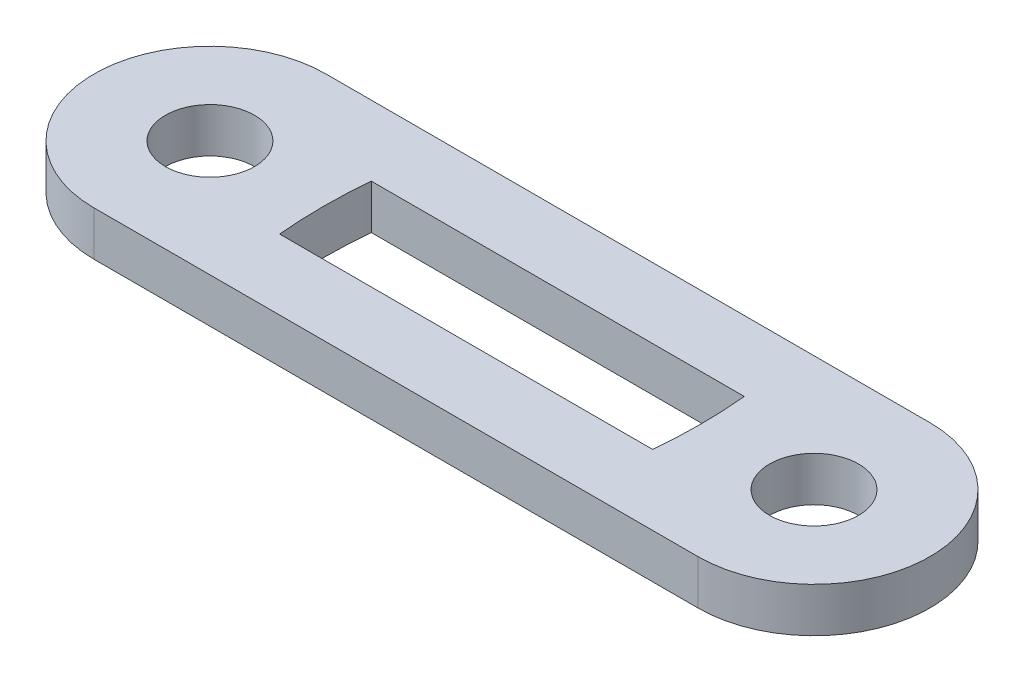
ISO-10303-21;
HEADER;
FILE_DESCRIPTION(('STEP AP214'),'2;1');
FILE_NAME('part.step','',(''),(''),'','','');
FILE_SCHEMA(('AUTOMOTIVE_DESIGN { 1 0 10303 214 1 1 1 1 }'));
ENDSEC;
DATA;
#1=APPLICATION_CONTEXT('core data for automotive mechanical design processes');
#2=APPLICATION_PROTOCOL_DEFINITION('international standard','automotive_design',2000,#1);
#3=PRODUCT_CONTEXT('',#1,'mechanical');
#4=PRODUCT('Part','Part','',(#3));
#5=PRODUCT_RELATED_PRODUCT_CATEGORY('part','',(#4));
#6=PRODUCT_DEFINITION_FORMATION('','',#4);
#7=PRODUCT_DEFINITION_CONTEXT('part definition',#1,'design');
#8=PRODUCT_DEFINITION('design','',#6,#7);
#9=PRODUCT_DEFINITION_SHAPE('','',#8);
#10=(LENGTH_UNIT() NAMED_UNIT(*) SI_UNIT(.MILLI.,.METRE.));
#11=(NAMED_UNIT(*) PLANE_ANGLE_UNIT() SI_UNIT($,.RADIAN.));
#12=(NAMED_UNIT(*) SI_UNIT($,.STERADIAN.) SOLID_ANGLE_UNIT());
#13=UNCERTAINTY_MEASURE_WITH_UNIT(LENGTH_MEASURE(1.E-05),#10,'distance_accuracy_value','');
#14=(GEOMETRIC_REPRESENTATION_CONTEXT(3) GLOBAL_UNCERTAINTY_ASSIGNED_CONTEXT((#13)) GLOBAL_UNIT_ASSIGNED_CONTEXT((#10,
#11,#12)) REPRESENTATION_CONTEXT('',''));
#15=CARTESIAN_POINT('',(0.,0.,0.));
#16=DIRECTION('',(0.,0.,1.));
#17=DIRECTION('',(1.,0.,0.));
#18=AXIS2_PLACEMENT_3D('',#15,#16,#17);
#19=CARTESIAN_POINT('',(0.,0.79375,4.13373631574245));
#20=DIRECTION('',(0.,0.,-1.));
#21=DIRECTION('',(-1.,0.,0.));
#22=AXIS2_PLACEMENT_3D('',#19,#20,#21);
#23=PLANE('',#22);
#24=DIRECTION('',(1.,0.,0.));
#25=VECTOR('',#24,1.);
#26=CARTESIAN_POINT('',(0.,-0.79375,4.13373631574245));
#27=LINE('',#26,#25);
#28=CARTESIAN_POINT('',(-10.765,-0.79375,4.13373631574245));
#29=VERTEX_POINT('',#28);
#30=CARTESIAN_POINT('',(10.765,-0.79375,4.13373631574245));
#31=VERTEX_POINT('',#30);
#32=EDGE_CURVE('E146',#29,#31,#27,.T.);
#33=ORIENTED_EDGE('',*,*,#32,.T.);
#34=DIRECTION('',(0.,-1.,0.));
#35=VECTOR('',#34,1.);
#36=CARTESIAN_POINT('',(10.765,0.79375,4.13373631574245));
#37=LINE('',#36,#35);
#38=CARTESIAN_POINT('',(10.765,0.79375,4.13373631574245));
#39=VERTEX_POINT('',#38);
#40=EDGE_CURVE('E11',#39,#31,#37,.T.);
#41=ORIENTED_EDGE('',*,*,#40,.F.);
#42=DIRECTION('',(1.,0.,0.));
#43=VECTOR('',#42,1.);
#44=CARTESIAN_POINT('',(0.,0.79375,4.13373631574245));
#45=LINE('',#44,#43);
#46=CARTESIAN_POINT('',(-10.765,0.79375,4.13373631574245));
#47=VERTEX_POINT('',#46);
#48=EDGE_CURVE('E116',#47,#39,#45,.T.);
#49=ORIENTED_EDGE('',*,*,#48,.F.);
#50=DIRECTION('',(0.,-1.,0.));
#51=VECTOR('',#50,1.);
#52=CARTESIAN_POINT('',(-10.765,0.79375,4.13373631574245));
#53=LINE('',#52,#51);
#54=EDGE_CURVE('E153',#47,#29,#53,.T.);
#55=ORIENTED_EDGE('',*,*,#54,.T.);
#56=EDGE_LOOP('',(#33,#41,#49,#55));
#57=FACE_BOUND('',#56,.T.);
#58=ADVANCED_FACE('F35',(#57),#23,.F.);
#59=CARTESIAN_POINT('',(10.765,0.79375,0.));
#60=DIRECTION('',(0.,-1.,0.));
#61=DIRECTION('',(0.,0.,-1.));
#62=AXIS2_PLACEMENT_3D('',#59,#60,#61);
#63=CYLINDRICAL_SURFACE('',#62,4.13373631574245);
#64=CARTESIAN_POINT('',(10.765,-0.79375,0.));
#65=DIRECTION('',(0.,1.,0.));
#66=DIRECTION('',(0.,0.,1.));
#67=AXIS2_PLACEMENT_3D('',#64,#65,#66);
#68=CIRCLE('',#67,4.13373631574245);
#69=CARTESIAN_POINT('',(10.765,-0.79375,-4.13373631574245));
#70=VERTEX_POINT('',#69);
#71=EDGE_CURVE('E121',#31,#70,#68,.T.);
#72=ORIENTED_EDGE('',*,*,#71,.T.);
#73=DIRECTION('',(0.,-1.,0.));
#74=VECTOR('',#73,1.);
#75=CARTESIAN_POINT('',(10.765,0.79375,-4.13373631574245));
#76=LINE('',#75,#74);
#77=CARTESIAN_POINT('',(10.765,0.79375,-4.13373631574245));
#78=VERTEX_POINT('',#77);
#79=EDGE_CURVE('E45',#78,#70,#76,.T.);
#80=ORIENTED_EDGE('',*,*,#79,.F.);
#81=CARTESIAN_POINT('',(10.765,0.79375,0.));
#82=DIRECTION('',(0.,1.,0.));
#83=DIRECTION('',(0.,0.,1.));
#84=AXIS2_PLACEMENT_3D('',#81,#82,#83);
#85=CIRCLE('',#84,4.13373631574245);
#86=EDGE_CURVE('E110',#39,#78,#85,.T.);
#87=ORIENTED_EDGE('',*,*,#86,.F.);
#88=ORIENTED_EDGE('',*,*,#40,.T.);
#89=EDGE_LOOP('',(#72,#80,#87,#88));
#90=FACE_BOUND('',#89,.T.);
#91=ADVANCED_FACE('F120',(#90),#63,.T.);
#92=CARTESIAN_POINT('',(0.,0.79375,-4.13373631574245));
#93=DIRECTION('',(0.,0.,1.));
#94=DIRECTION('',(1.,0.,0.));
#95=AXIS2_PLACEMENT_3D('',#92,#93,#94);
#96=PLANE('',#95);
#97=DIRECTION('',(-1.,0.,0.));
#98=VECTOR('',#97,1.);
#99=CARTESIAN_POINT('',(0.,-0.79375,-4.13373631574245));
#100=LINE('',#99,#98);
#101=CARTESIAN_POINT('',(-10.765,-0.79375,-4.13373631574245));
#102=VERTEX_POINT('',#101);
#103=EDGE_CURVE('E83',#70,#102,#100,.T.);
#104=ORIENTED_EDGE('',*,*,#103,.T.);
#105=DIRECTION('',(0.,-1.,0.));
#106=VECTOR('',#105,1.);
#107=CARTESIAN_POINT('',(-10.765,0.79375,-4.13373631574245));
#108=LINE('',#107,#106);
#109=CARTESIAN_POINT('',(-10.765,0.79375,-4.13373631574245));
#110=VERTEX_POINT('',#109);
#111=EDGE_CURVE('E122',#110,#102,#108,.T.);
#112=ORIENTED_EDGE('',*,*,#111,.F.);
#113=DIRECTION('',(-1.,0.,0.));
#114=VECTOR('',#113,1.);
#115=CARTESIAN_POINT('',(0.,0.79375,-4.13373631574245));
#116=LINE('',#115,#114);
#117=EDGE_CURVE('E114',#78,#110,#116,.T.);
#118=ORIENTED_EDGE('',*,*,#117,.F.);
#119=ORIENTED_EDGE('',*,*,#79,.T.);
#120=EDGE_LOOP('',(#104,#112,#118,#119));
#121=FACE_BOUND('',#120,.T.);
#122=ADVANCED_FACE('F124',(#121),#96,.F.);
#123=CARTESIAN_POINT('',(10.765,0.79375,0.));
#124=DIRECTION('',(0.,-1.,0.));
#125=DIRECTION('',(0.,0.,-1.));
#126=AXIS2_PLACEMENT_3D('',#123,#124,#125);
#127=CYLINDRICAL_SURFACE('',#126,17.4887926342159);
#128=CARTESIAN_POINT('',(10.765,-0.79375,0.));
#129=DIRECTION('',(0.,1.,0.));
#130=DIRECTION('',(0.,0.,1.));
#131=AXIS2_PLACEMENT_3D('',#128,#129,#130);
#132=CIRCLE('',#131,17.4887926342159);
#133=CARTESIAN_POINT('',(-6.64731671700317,-0.79375,-1.63373631574245));
#134=VERTEX_POINT('',#133);
#135=CARTESIAN_POINT('',(-6.64731671700317,-0.79375,1.63373631574245));
#136=VERTEX_POINT('',#135);
#137=EDGE_CURVE('E130',#134,#136,#132,.T.);
#138=ORIENTED_EDGE('',*,*,#137,.F.);
#139=DIRECTION('',(0.,-1.,0.));
#140=VECTOR('',#139,1.);
#141=CARTESIAN_POINT('',(-6.64731671700317,0.79375,-1.63373631574245));
#142=LINE('',#141,#140);
#143=CARTESIAN_POINT('',(-6.64731671700317,0.79375,-1.63373631574245));
#144=VERTEX_POINT('',#143);
#145=EDGE_CURVE('E39',#144,#134,#142,.T.);
#146=ORIENTED_EDGE('',*,*,#145,.F.);
#147=CARTESIAN_POINT('',(10.765,0.79375,0.));
#148=DIRECTION('',(0.,1.,0.));
#149=DIRECTION('',(0.,0.,1.));
#150=AXIS2_PLACEMENT_3D('',#147,#148,#149);
#151=CIRCLE('',#150,17.4887926342159);
#152=CARTESIAN_POINT('',(-6.64731671700317,0.79375,1.63373631574245));
#153=VERTEX_POINT('',#152);
#154=EDGE_CURVE('E152',#144,#153,#151,.T.);
#155=ORIENTED_EDGE('',*,*,#154,.T.);
#156=DIRECTION('',(0.,-1.,0.));
#157=VECTOR('',#156,1.);
#158=CARTESIAN_POINT('',(-6.64731671700317,0.79375,1.63373631574245));
#159=LINE('',#158,#157);
#160=EDGE_CURVE('E126',#153,#136,#159,.T.);
#161=ORIENTED_EDGE('',*,*,#160,.T.);
#162=EDGE_LOOP('',(#138,#146,#155,#161));
#163=FACE_BOUND('',#162,.T.);
#164=ADVANCED_FACE('F37',(#163),#127,.F.);
#165=CARTESIAN_POINT('',(0.,0.79375,-1.63373631574245));
#166=DIRECTION('',(0.,0.,-1.));
#167=DIRECTION('',(-1.,0.,0.));
#168=AXIS2_PLACEMENT_3D('',#165,#166,#167);
#169=PLANE('',#168);
#170=DIRECTION('',(1.,0.,0.));
#171=VECTOR('',#170,1.);
#172=CARTESIAN_POINT('',(0.,-0.79375,-1.63373631574245));
#173=LINE('',#172,#171);
#174=CARTESIAN_POINT('',(6.64731671700317,-0.79375,-1.63373631574245));
#175=VERTEX_POINT('',#174);
#176=EDGE_CURVE('E133',#134,#175,#173,.T.);
#177=ORIENTED_EDGE('',*,*,#176,.T.);
#178=DIRECTION('',(0.,-1.,0.));
#179=VECTOR('',#178,1.);
#180=CARTESIAN_POINT('',(6.64731671700317,0.79375,-1.63373631574245));
#181=LINE('',#180,#179);
#182=CARTESIAN_POINT('',(6.64731671700317,0.79375,-1.63373631574245));
#183=VERTEX_POINT('',#182);
#184=EDGE_CURVE('E159',#183,#175,#181,.T.);
#185=ORIENTED_EDGE('',*,*,#184,.F.);
#186=DIRECTION('',(1.,0.,0.));
#187=VECTOR('',#186,1.);
#188=CARTESIAN_POINT('',(0.,0.79375,-1.63373631574245));
#189=LINE('',#188,#187);
#190=EDGE_CURVE('E168',#144,#183,#189,.T.);
#191=ORIENTED_EDGE('',*,*,#190,.F.);
#192=ORIENTED_EDGE('',*,*,#145,.T.);
#193=EDGE_LOOP('',(#177,#185,#191,#192));
#194=FACE_BOUND('',#193,.T.);
#195=ADVANCED_FACE('F167',(#194),#169,.F.);
#196=CARTESIAN_POINT('',(-10.765,0.79375,0.));
#197=DIRECTION('',(0.,-1.,0.));
#198=DIRECTION('',(0.,0.,-1.));
#199=AXIS2_PLACEMENT_3D('',#196,#197,#198);
#200=CYLINDRICAL_SURFACE('',#199,17.4887926342159);
#201=CARTESIAN_POINT('',(-10.765,-0.79375,0.));
#202=DIRECTION('',(0.,1.,0.));
#203=DIRECTION('',(0.,0.,1.));
#204=AXIS2_PLACEMENT_3D('',#201,#202,#203);
#205=CIRCLE('',#204,17.4887926342159);
#206=CARTESIAN_POINT('',(6.64731671700317,-0.79375,1.63373631574245));
#207=VERTEX_POINT('',#206);
#208=EDGE_CURVE('E135',#175,#207,#205,.F.);
#209=ORIENTED_EDGE('',*,*,#208,.T.);
#210=DIRECTION('',(0.,-1.,0.));
#211=VECTOR('',#210,1.);
#212=CARTESIAN_POINT('',(6.64731671700317,0.79375,1.63373631574245));
#213=LINE('',#212,#211);
#214=CARTESIAN_POINT('',(6.64731671700317,0.79375,1.63373631574245));
#215=VERTEX_POINT('',#214);
#216=EDGE_CURVE('E157',#215,#207,#213,.T.);
#217=ORIENTED_EDGE('',*,*,#216,.F.);
#218=CARTESIAN_POINT('',(-10.765,0.79375,0.));
#219=DIRECTION('',(0.,1.,0.));
#220=DIRECTION('',(0.,0.,1.));
#221=AXIS2_PLACEMENT_3D('',#218,#219,#220);
#222=CIRCLE('',#221,17.4887926342159);
#223=EDGE_CURVE('E181',#183,#215,#222,.F.);
#224=ORIENTED_EDGE('',*,*,#223,.F.);
#225=ORIENTED_EDGE('',*,*,#184,.T.);
#226=EDGE_LOOP('',(#209,#217,#224,#225));
#227=FACE_BOUND('',#226,.T.);
#228=ADVANCED_FACE('F180',(#227),#200,.F.);
#229=CARTESIAN_POINT('',(-10.765,0.79375,0.));
#230=DIRECTION('',(0.,-1.,0.));
#231=DIRECTION('',(0.,0.,-1.));
#232=AXIS2_PLACEMENT_3D('',#229,#230,#231);
#233=CYLINDRICAL_SURFACE('',#232,1.5875);
#234=CARTESIAN_POINT('',(-10.765,0.79375,0.));
#235=DIRECTION('',(0.,1.,0.));
#236=DIRECTION('',(0.,0.,1.));
#237=AXIS2_PLACEMENT_3D('',#234,#235,#236);
#238=CIRCLE('',#237,1.5875);
#239=CARTESIAN_POINT('',(-10.765,0.79375,1.5875));
#240=VERTEX_POINT('',#239);
#241=EDGE_CURVE('E191',#240,#240,#238,.T.);
#242=ORIENTED_EDGE('',*,*,#241,.T.);
#243=EDGE_LOOP('',(#242));
#244=FACE_BOUND('',#243,.T.);
#245=CARTESIAN_POINT('',(-10.765,-0.79375,0.));
#246=DIRECTION('',(0.,1.,0.));
#247=DIRECTION('',(0.,0.,1.));
#248=AXIS2_PLACEMENT_3D('',#245,#246,#247);
#249=CIRCLE('',#248,1.5875);
#250=CARTESIAN_POINT('',(-10.765,-0.79375,1.5875));
#251=VERTEX_POINT('',#250);
#252=EDGE_CURVE('E143',#251,#251,#249,.T.);
#253=ORIENTED_EDGE('',*,*,#252,.F.);
#254=EDGE_LOOP('',(#253));
#255=FACE_BOUND('',#254,.T.);
#256=ADVANCED_FACE('F195',(#244,#255),#233,.F.);
#257=CARTESIAN_POINT('',(10.765,0.79375,0.));
#258=DIRECTION('',(0.,-1.,0.));
#259=DIRECTION('',(0.,0.,-1.));
#260=AXIS2_PLACEMENT_3D('',#257,#258,#259);
#261=CYLINDRICAL_SURFACE('',#260,1.5875);
#262=CARTESIAN_POINT('',(10.765,0.79375,0.));
#263=DIRECTION('',(0.,1.,0.));
#264=DIRECTION('',(0.,0.,1.));
#265=AXIS2_PLACEMENT_3D('',#262,#263,#264);
#266=CIRCLE('',#265,1.5875);
#267=CARTESIAN_POINT('',(10.765,0.79375,1.5875));
#268=VERTEX_POINT('',#267);
#269=EDGE_CURVE('E184',#268,#268,#266,.T.);
#270=ORIENTED_EDGE('',*,*,#269,.T.);
#271=EDGE_LOOP('',(#270));
#272=FACE_BOUND('',#271,.T.);
#273=CARTESIAN_POINT('',(10.765,-0.79375,0.));
#274=DIRECTION('',(0.,1.,0.));
#275=DIRECTION('',(0.,0.,1.));
#276=AXIS2_PLACEMENT_3D('',#273,#274,#275);
#277=CIRCLE('',#276,1.5875);
#278=CARTESIAN_POINT('',(10.765,-0.79375,1.5875));
#279=VERTEX_POINT('',#278);
#280=EDGE_CURVE('E140',#279,#279,#277,.T.);
#281=ORIENTED_EDGE('',*,*,#280,.F.);
#282=EDGE_LOOP('',(#281));
#283=FACE_BOUND('',#282,.T.);
#284=ADVANCED_FACE('F219',(#272,#283),#261,.F.);
#285=CARTESIAN_POINT('',(0.,0.79375,1.63373631574245));
#286=DIRECTION('',(0.,0.,1.));
#287=DIRECTION('',(1.,0.,0.));
#288=AXIS2_PLACEMENT_3D('',#285,#286,#287);
#289=PLANE('',#288);
#290=DIRECTION('',(-1.,0.,0.));
#291=VECTOR('',#290,1.);
#292=CARTESIAN_POINT('',(0.,-0.79375,1.63373631574245));
#293=LINE('',#292,#291);
#294=EDGE_CURVE('E137',#207,#136,#293,.T.);
#295=ORIENTED_EDGE('',*,*,#294,.T.);
#296=ORIENTED_EDGE('',*,*,#160,.F.);
#297=DIRECTION('',(-1.,0.,0.));
#298=VECTOR('',#297,1.);
#299=CARTESIAN_POINT('',(0.,0.79375,1.63373631574245));
#300=LINE('',#299,#298);
#301=EDGE_CURVE('E179',#215,#153,#300,.T.);
#302=ORIENTED_EDGE('',*,*,#301,.F.);
#303=ORIENTED_EDGE('',*,*,#216,.T.);
#304=EDGE_LOOP('',(#295,#296,#302,#303));
#305=FACE_BOUND('',#304,.T.);
#306=ADVANCED_FACE('F177',(#305),#289,.F.);
#307=CARTESIAN_POINT('',(-10.765,0.79375,0.));
#308=DIRECTION('',(0.,-1.,0.));
#309=DIRECTION('',(0.,0.,-1.));
#310=AXIS2_PLACEMENT_3D('',#307,#308,#309);
#311=CYLINDRICAL_SURFACE('',#310,4.13373631574245);
#312=CARTESIAN_POINT('',(-10.765,-0.79375,0.));
#313=DIRECTION('',(0.,1.,0.));
#314=DIRECTION('',(0.,0.,1.));
#315=AXIS2_PLACEMENT_3D('',#312,#313,#314);
#316=CIRCLE('',#315,4.13373631574245);
#317=EDGE_CURVE('E89',#102,#29,#316,.T.);
#318=ORIENTED_EDGE('',*,*,#317,.T.);
#319=ORIENTED_EDGE('',*,*,#54,.F.);
#320=CARTESIAN_POINT('',(-10.765,0.79375,0.));
#321=DIRECTION('',(0.,1.,0.));
#322=DIRECTION('',(0.,0.,1.));
#323=AXIS2_PLACEMENT_3D('',#320,#321,#322);
#324=CIRCLE('',#323,4.13373631574245);
#325=EDGE_CURVE('E54',#110,#47,#324,.T.);
#326=ORIENTED_EDGE('',*,*,#325,.F.);
#327=ORIENTED_EDGE('',*,*,#111,.T.);
#328=EDGE_LOOP('',(#318,#319,#326,#327));
#329=FACE_BOUND('',#328,.T.);
#330=ADVANCED_FACE('F199',(#329),#311,.T.);
#331=CARTESIAN_POINT('',(0.,0.79375,0.));
#332=DIRECTION('',(0.,1.,0.));
#333=DIRECTION('',(0.,0.,1.));
#334=AXIS2_PLACEMENT_3D('',#331,#332,#333);
#335=PLANE('',#334);
#336=ORIENTED_EDGE('',*,*,#154,.F.);
#337=ORIENTED_EDGE('',*,*,#190,.T.);
#338=ORIENTED_EDGE('',*,*,#223,.T.);
#339=ORIENTED_EDGE('',*,*,#301,.T.);
#340=EDGE_LOOP('',(#336,#337,#338,#339));
#341=FACE_BOUND('',#340,.T.);
#342=ORIENTED_EDGE('',*,*,#269,.F.);
#343=EDGE_LOOP('',(#342));
#344=FACE_BOUND('',#343,.T.);
#345=ORIENTED_EDGE('',*,*,#241,.F.);
#346=EDGE_LOOP('',(#345));
#347=FACE_BOUND('',#346,.T.);
#348=ORIENTED_EDGE('',*,*,#48,.T.);
#349=ORIENTED_EDGE('',*,*,#86,.T.);
#350=ORIENTED_EDGE('',*,*,#117,.T.);
#351=ORIENTED_EDGE('',*,*,#325,.T.);
#352=EDGE_LOOP('',(#348,#349,#350,#351));
#353=FACE_BOUND('',#352,.T.);
#354=ADVANCED_FACE('F112',(#341,#344,#347,#353),#335,.T.);
#355=CARTESIAN_POINT('',(0.,-0.79375,0.));
#356=DIRECTION('',(0.,1.,0.));
#357=DIRECTION('',(0.,0.,1.));
#358=AXIS2_PLACEMENT_3D('',#355,#356,#357);
#359=PLANE('',#358);
#360=ORIENTED_EDGE('',*,*,#137,.T.);
#361=ORIENTED_EDGE('',*,*,#294,.F.);
#362=ORIENTED_EDGE('',*,*,#208,.F.);
#363=ORIENTED_EDGE('',*,*,#176,.F.);
#364=EDGE_LOOP('',(#360,#361,#362,#363));
#365=FACE_BOUND('',#364,.T.);
#366=ORIENTED_EDGE('',*,*,#280,.T.);
#367=EDGE_LOOP('',(#366));
#368=FACE_BOUND('',#367,.T.);
#369=ORIENTED_EDGE('',*,*,#252,.T.);
#370=EDGE_LOOP('',(#369));
#371=FACE_BOUND('',#370,.T.);
#372=ORIENTED_EDGE('',*,*,#32,.F.);
#373=ORIENTED_EDGE('',*,*,#317,.F.);
#374=ORIENTED_EDGE('',*,*,#103,.F.);
#375=ORIENTED_EDGE('',*,*,#71,.F.);
#376=EDGE_LOOP('',(#372,#373,#374,#375));
#377=FACE_BOUND('',#376,.T.);
#378=ADVANCED_FACE('F171',(#365,#368,#371,#377),#359,.F.);
#379=CLOSED_SHELL('',(#58,#91,#122,#164,#195,#228,#256,#284,#306,#330,#354,#378));
#380=MANIFOLD_SOLID_BREP('B2',#379);
#381=ADVANCED_BREP_SHAPE_REPRESENTATION('',(#18,#380),#14);
#382=SHAPE_DEFINITION_REPRESENTATION(#9,#381);
ENDSEC;
END-ISO-10303-21;
